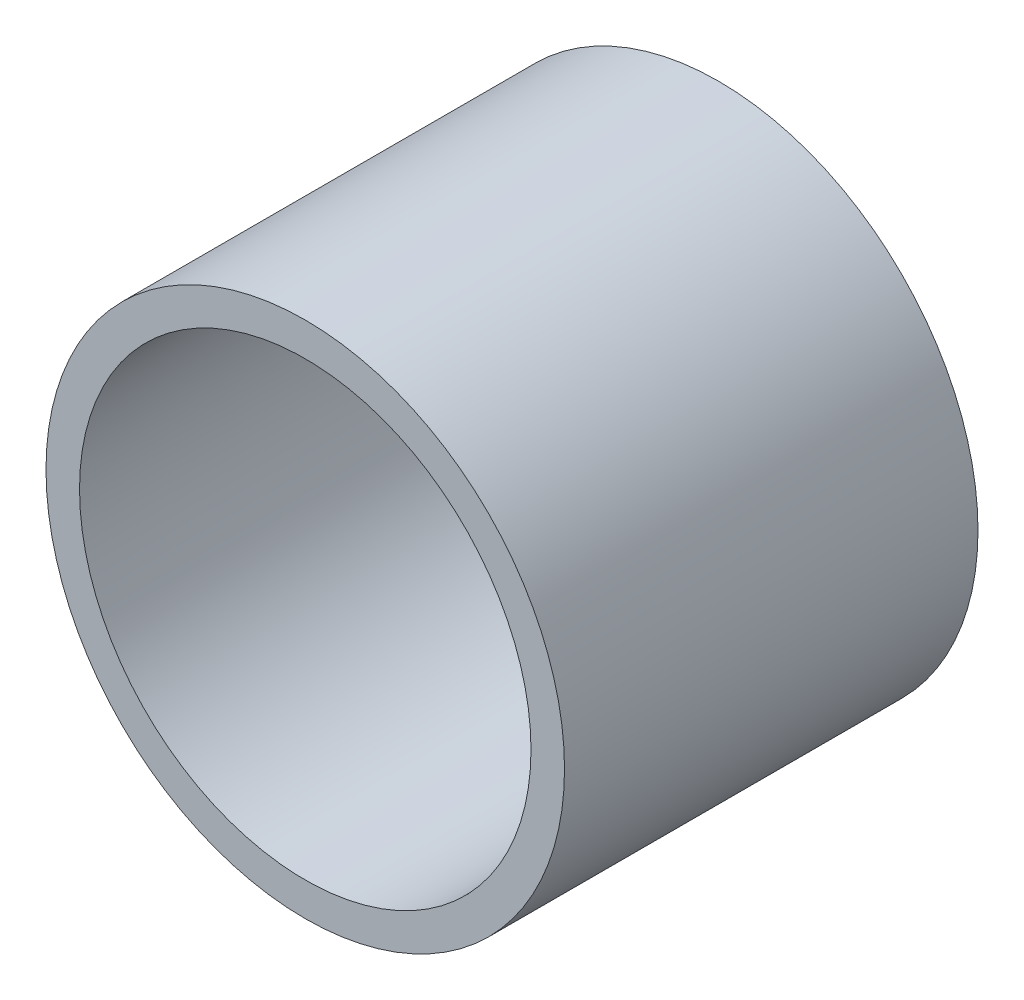
ISO-10303-21;
HEADER;
FILE_DESCRIPTION(('STEP AP214'),'2;1');
FILE_NAME('part.step','',(''),(''),'','','');
FILE_SCHEMA(('AUTOMOTIVE_DESIGN { 1 0 10303 214 1 1 1 1 }'));
ENDSEC;
DATA;
#1=APPLICATION_CONTEXT('core data for automotive mechanical design processes');
#2=APPLICATION_PROTOCOL_DEFINITION('international standard','automotive_design',2000,#1);
#3=PRODUCT_CONTEXT('',#1,'mechanical');
#4=PRODUCT('Part','Part','',(#3));
#5=PRODUCT_RELATED_PRODUCT_CATEGORY('part','',(#4));
#6=PRODUCT_DEFINITION_FORMATION('','',#4);
#7=PRODUCT_DEFINITION_CONTEXT('part definition',#1,'design');
#8=PRODUCT_DEFINITION('design','',#6,#7);
#9=PRODUCT_DEFINITION_SHAPE('','',#8);
#10=(LENGTH_UNIT() NAMED_UNIT(*) SI_UNIT(.MILLI.,.METRE.));
#11=(NAMED_UNIT(*) PLANE_ANGLE_UNIT() SI_UNIT($,.RADIAN.));
#12=(NAMED_UNIT(*) SI_UNIT($,.STERADIAN.) SOLID_ANGLE_UNIT());
#13=UNCERTAINTY_MEASURE_WITH_UNIT(LENGTH_MEASURE(1.E-05),#10,'distance_accuracy_value','');
#14=(GEOMETRIC_REPRESENTATION_CONTEXT(3) GLOBAL_UNCERTAINTY_ASSIGNED_CONTEXT((#13)) GLOBAL_UNIT_ASSIGNED_CONTEXT((#10,
#11,#12)) REPRESENTATION_CONTEXT('',''));
#15=CARTESIAN_POINT('',(0.,0.,0.));
#16=DIRECTION('',(0.,0.,1.));
#17=DIRECTION('',(1.,0.,0.));
#18=AXIS2_PLACEMENT_3D('',#15,#16,#17);
#19=CARTESIAN_POINT('',(0.,0.,16.));
#20=DIRECTION('',(0.,0.,1.));
#21=DIRECTION('',(1.,0.,0.));
#22=AXIS2_PLACEMENT_3D('',#19,#20,#21);
#23=PLANE('',#22);
#24=CARTESIAN_POINT('',(0.,0.,16.));
#25=DIRECTION('',(0.,0.,1.));
#26=DIRECTION('',(1.,0.,0.));
#27=AXIS2_PLACEMENT_3D('',#24,#25,#26);
#28=CIRCLE('',#27,11.6);
#29=CARTESIAN_POINT('',(11.6,0.,16.));
#30=VERTEX_POINT('',#29);
#31=EDGE_CURVE('E10',#30,#30,#28,.T.);
#32=ORIENTED_EDGE('',*,*,#31,.T.);
#33=EDGE_LOOP('',(#32));
#34=FACE_BOUND('',#33,.T.);
#35=CARTESIAN_POINT('',(0.,0.,16.));
#36=DIRECTION('',(0.,0.,1.));
#37=DIRECTION('',(1.,0.,0.));
#38=AXIS2_PLACEMENT_3D('',#35,#36,#37);
#39=CIRCLE('',#38,10.1);
#40=CARTESIAN_POINT('',(10.1,0.,16.));
#41=VERTEX_POINT('',#40);
#42=EDGE_CURVE('E45',#41,#41,#39,.T.);
#43=ORIENTED_EDGE('',*,*,#42,.F.);
#44=EDGE_LOOP('',(#43));
#45=FACE_BOUND('',#44,.T.);
#46=ADVANCED_FACE('F37',(#34,#45),#23,.T.);
#47=CARTESIAN_POINT('',(0.,0.,16.));
#48=DIRECTION('',(0.,0.,-1.));
#49=DIRECTION('',(-1.,0.,0.));
#50=AXIS2_PLACEMENT_3D('',#47,#48,#49);
#51=CYLINDRICAL_SURFACE('',#50,11.6);
#52=ORIENTED_EDGE('',*,*,#31,.F.);
#53=EDGE_LOOP('',(#52));
#54=FACE_BOUND('',#53,.T.);
#55=CARTESIAN_POINT('',(0.,0.,-2.5));
#56=DIRECTION('',(0.,0.,-1.));
#57=DIRECTION('',(-1.,0.,0.));
#58=AXIS2_PLACEMENT_3D('',#55,#56,#57);
#59=CIRCLE('',#58,11.6);
#60=CARTESIAN_POINT('',(-11.6,0.,-2.5));
#61=VERTEX_POINT('',#60);
#62=EDGE_CURVE('E56',#61,#61,#59,.T.);
#63=ORIENTED_EDGE('',*,*,#62,.F.);
#64=EDGE_LOOP('',(#63));
#65=FACE_BOUND('',#64,.T.);
#66=ADVANCED_FACE('F39',(#54,#65),#51,.T.);
#67=CARTESIAN_POINT('',(0.,0.,16.));
#68=DIRECTION('',(0.,0.,-1.));
#69=DIRECTION('',(-1.,0.,0.));
#70=AXIS2_PLACEMENT_3D('',#67,#68,#69);
#71=CYLINDRICAL_SURFACE('',#70,10.1);
#72=ORIENTED_EDGE('',*,*,#42,.T.);
#73=EDGE_LOOP('',(#72));
#74=FACE_BOUND('',#73,.T.);
#75=CARTESIAN_POINT('',(0.,0.,0.));
#76=DIRECTION('',(0.,0.,1.));
#77=DIRECTION('',(1.,0.,0.));
#78=AXIS2_PLACEMENT_3D('',#75,#76,#77);
#79=CIRCLE('',#78,10.1);
#80=CARTESIAN_POINT('',(10.1,0.,0.));
#81=VERTEX_POINT('',#80);
#82=EDGE_CURVE('E50',#81,#81,#79,.T.);
#83=ORIENTED_EDGE('',*,*,#82,.F.);
#84=EDGE_LOOP('',(#83));
#85=FACE_BOUND('',#84,.T.);
#86=ADVANCED_FACE('F86',(#74,#85),#71,.F.);
#87=CARTESIAN_POINT('',(0.,0.,0.));
#88=DIRECTION('',(0.,0.,-1.));
#89=DIRECTION('',(-1.,0.,0.));
#90=AXIS2_PLACEMENT_3D('',#87,#88,#89);
#91=PLANE('',#90);
#92=ORIENTED_EDGE('',*,*,#82,.T.);
#93=EDGE_LOOP('',(#92));
#94=FACE_BOUND('',#93,.T.);
#95=ADVANCED_FACE('F81',(#94),#91,.F.);
#96=CARTESIAN_POINT('',(0.,0.,-2.5));
#97=DIRECTION('',(0.,0.,-1.));
#98=DIRECTION('',(-1.,0.,0.));
#99=AXIS2_PLACEMENT_3D('',#96,#97,#98);
#100=PLANE('',#99);
#101=CARTESIAN_POINT('',(0.,0.,-2.5));
#102=DIRECTION('',(0.,0.,-1.));
#103=DIRECTION('',(-1.,0.,0.));
#104=AXIS2_PLACEMENT_3D('',#101,#102,#103);
#105=CIRCLE('',#104,3.15);
#106=CARTESIAN_POINT('',(-3.15,0.,-2.5));
#107=VERTEX_POINT('',#106);
#108=EDGE_CURVE('E62',#107,#107,#105,.T.);
#109=ORIENTED_EDGE('',*,*,#108,.F.);
#110=EDGE_LOOP('',(#109));
#111=FACE_BOUND('',#110,.T.);
#112=ORIENTED_EDGE('',*,*,#62,.T.);
#113=EDGE_LOOP('',(#112));
#114=FACE_BOUND('',#113,.T.);
#115=ADVANCED_FACE('F75',(#111,#114),#100,.T.);
#116=CARTESIAN_POINT('',(0.,0.,-0.5));
#117=DIRECTION('',(0.,0.,-1.));
#118=DIRECTION('',(-1.,0.,0.));
#119=AXIS2_PLACEMENT_3D('',#116,#117,#118);
#120=CYLINDRICAL_SURFACE('',#119,3.15);
#121=CARTESIAN_POINT('',(0.,0.,-0.5));
#122=DIRECTION('',(0.,0.,-1.));
#123=DIRECTION('',(-1.,0.,0.));
#124=AXIS2_PLACEMENT_3D('',#121,#122,#123);
#125=CIRCLE('',#124,3.15);
#126=CARTESIAN_POINT('',(-3.15,0.,-0.5));
#127=VERTEX_POINT('',#126);
#128=EDGE_CURVE('E61',#127,#127,#125,.T.);
#129=ORIENTED_EDGE('',*,*,#128,.F.);
#130=EDGE_LOOP('',(#129));
#131=FACE_BOUND('',#130,.T.);
#132=ORIENTED_EDGE('',*,*,#108,.T.);
#133=EDGE_LOOP('',(#132));
#134=FACE_BOUND('',#133,.T.);
#135=ADVANCED_FACE('F72',(#131,#134),#120,.F.);
#136=CARTESIAN_POINT('',(0.,0.,-0.5));
#137=DIRECTION('',(0.,0.,-1.));
#138=DIRECTION('',(-1.,0.,0.));
#139=AXIS2_PLACEMENT_3D('',#136,#137,#138);
#140=PLANE('',#139);
#141=ORIENTED_EDGE('',*,*,#128,.T.);
#142=EDGE_LOOP('',(#141));
#143=FACE_BOUND('',#142,.T.);
#144=ADVANCED_FACE('F70',(#143),#140,.T.);
#145=CLOSED_SHELL('',(#46,#66,#86,#95,#115,#135,#144));
#146=MANIFOLD_SOLID_BREP('B2',#145);
#147=ADVANCED_BREP_SHAPE_REPRESENTATION('',(#18,#146),#14);
#148=SHAPE_DEFINITION_REPRESENTATION(#9,#147);
ENDSEC;
END-ISO-10303-21;
